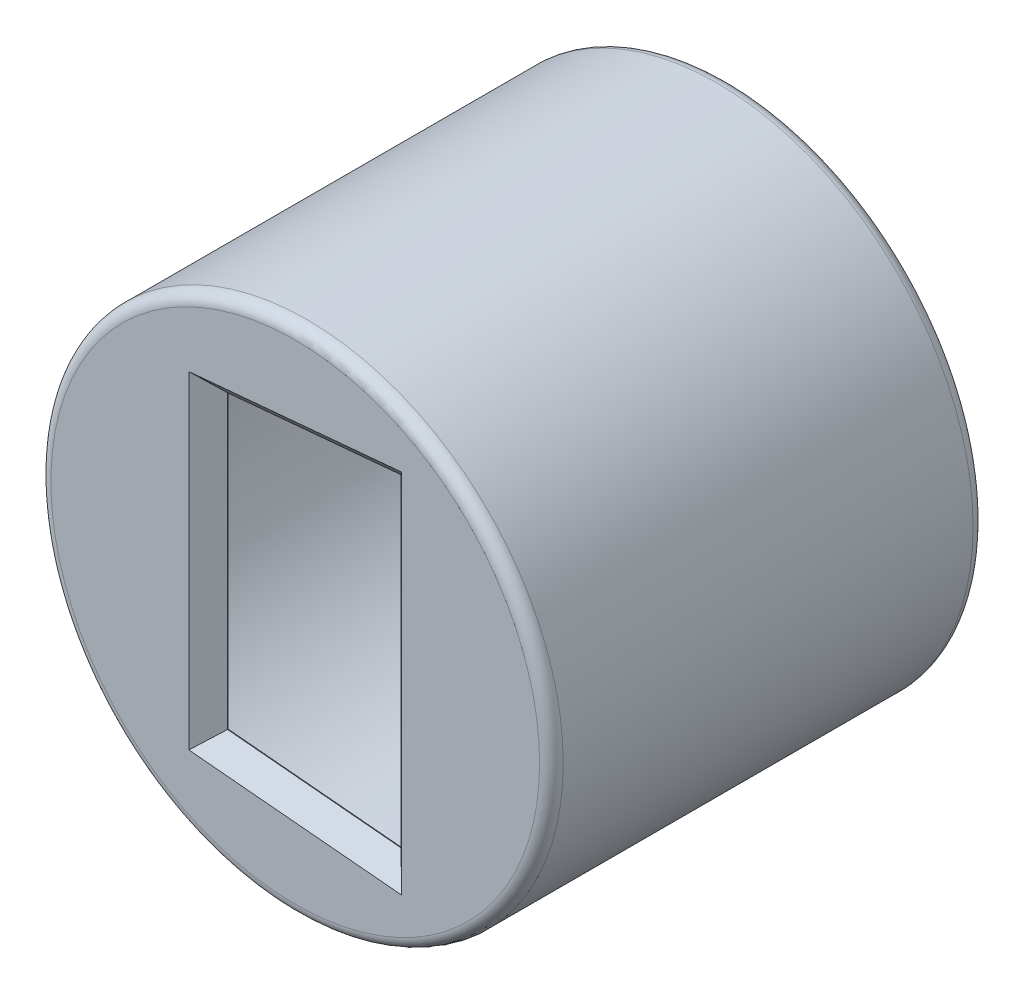
ISO-10303-21;
HEADER;
FILE_DESCRIPTION(('STEP AP214'),'2;1');
FILE_NAME('part.step','',(''),(''),'','','');
FILE_SCHEMA(('AUTOMOTIVE_DESIGN { 1 0 10303 214 1 1 1 1 }'));
ENDSEC;
DATA;
#1=APPLICATION_CONTEXT('core data for automotive mechanical design processes');
#2=APPLICATION_PROTOCOL_DEFINITION('international standard','automotive_design',2000,#1);
#3=PRODUCT_CONTEXT('',#1,'mechanical');
#4=PRODUCT('Part','Part','',(#3));
#5=PRODUCT_RELATED_PRODUCT_CATEGORY('part','',(#4));
#6=PRODUCT_DEFINITION_FORMATION('','',#4);
#7=PRODUCT_DEFINITION_CONTEXT('part definition',#1,'design');
#8=PRODUCT_DEFINITION('design','',#6,#7);
#9=PRODUCT_DEFINITION_SHAPE('','',#8);
#10=(LENGTH_UNIT() NAMED_UNIT(*) SI_UNIT(.MILLI.,.METRE.));
#11=(NAMED_UNIT(*) PLANE_ANGLE_UNIT() SI_UNIT($,.RADIAN.));
#12=(NAMED_UNIT(*) SI_UNIT($,.STERADIAN.) SOLID_ANGLE_UNIT());
#13=UNCERTAINTY_MEASURE_WITH_UNIT(LENGTH_MEASURE(1.E-05),#10,'distance_accuracy_value','');
#14=(GEOMETRIC_REPRESENTATION_CONTEXT(3) GLOBAL_UNCERTAINTY_ASSIGNED_CONTEXT((#13)) GLOBAL_UNIT_ASSIGNED_CONTEXT((#10,
#11,#12)) REPRESENTATION_CONTEXT('',''));
#15=CARTESIAN_POINT('',(0.,0.,0.));
#16=DIRECTION('',(0.,0.,1.));
#17=DIRECTION('',(1.,0.,0.));
#18=AXIS2_PLACEMENT_3D('',#15,#16,#17);
#19=CARTESIAN_POINT('',(0.,0.,10.));
#20=DIRECTION('',(0.,0.,-1.));
#21=DIRECTION('',(-1.,0.,0.));
#22=AXIS2_PLACEMENT_3D('',#19,#20,#21);
#23=CYLINDRICAL_SURFACE('',#22,6.5);
#24=CARTESIAN_POINT('',(0.,0.,-0.200000000000001));
#25=DIRECTION('',(0.,0.,-1.));
#26=DIRECTION('',(-1.,0.,0.));
#27=AXIS2_PLACEMENT_3D('',#24,#25,#26);
#28=CIRCLE('',#27,6.5);
#29=CARTESIAN_POINT('',(-6.5,0.,-0.200000000000001));
#30=VERTEX_POINT('',#29);
#31=EDGE_CURVE('E53',#30,#30,#28,.F.);
#32=ORIENTED_EDGE('',*,*,#31,.T.);
#33=EDGE_LOOP('',(#32));
#34=FACE_BOUND('',#33,.T.);
#35=CARTESIAN_POINT('',(0.,0.,10.2));
#36=DIRECTION('',(0.,0.,1.));
#37=DIRECTION('',(1.,0.,0.));
#38=AXIS2_PLACEMENT_3D('',#35,#36,#37);
#39=CIRCLE('',#38,6.5);
#40=CARTESIAN_POINT('',(6.5,0.,10.2));
#41=VERTEX_POINT('',#40);
#42=EDGE_CURVE('E266',#41,#41,#39,.F.);
#43=ORIENTED_EDGE('',*,*,#42,.T.);
#44=EDGE_LOOP('',(#43));
#45=FACE_BOUND('',#44,.T.);
#46=ADVANCED_FACE('F45',(#34,#45),#23,.T.);
#47=CARTESIAN_POINT('',(0.,0.,-0.5));
#48=DIRECTION('',(0.,0.,-1.));
#49=DIRECTION('',(-1.,0.,0.));
#50=AXIS2_PLACEMENT_3D('',#47,#48,#49);
#51=PLANE('',#50);
#52=CARTESIAN_POINT('',(0.,0.,-0.5));
#53=DIRECTION('',(0.,0.,-1.));
#54=DIRECTION('',(-1.,0.,0.));
#55=AXIS2_PLACEMENT_3D('',#52,#53,#54);
#56=CIRCLE('',#55,6.2);
#57=CARTESIAN_POINT('',(-6.2,0.,-0.5));
#58=VERTEX_POINT('',#57);
#59=EDGE_CURVE('E263',#58,#58,#56,.T.);
#60=ORIENTED_EDGE('',*,*,#59,.T.);
#61=EDGE_LOOP('',(#60));
#62=FACE_BOUND('',#61,.T.);
#63=DIRECTION('',(0.,1.,0.));
#64=VECTOR('',#63,1.);
#65=CARTESIAN_POINT('',(-1.45,1.8,-0.5));
#66=LINE('',#65,#64);
#67=CARTESIAN_POINT('',(-1.45,-1.7,-0.5));
#68=VERTEX_POINT('',#67);
#69=CARTESIAN_POINT('',(-1.45,1.7,-0.5));
#70=VERTEX_POINT('',#69);
#71=EDGE_CURVE('E285',#68,#70,#66,.T.);
#72=ORIENTED_EDGE('',*,*,#71,.F.);
#73=CARTESIAN_POINT('',(-1.35,-1.7,-0.5));
#74=DIRECTION('',(0.,0.,-1.));
#75=DIRECTION('',(-1.,0.,0.));
#76=AXIS2_PLACEMENT_3D('',#73,#74,#75);
#77=CIRCLE('',#76,0.1);
#78=CARTESIAN_POINT('',(-1.35,-1.8,-0.5));
#79=VERTEX_POINT('',#78);
#80=EDGE_CURVE('E248',#68,#79,#77,.F.);
#81=ORIENTED_EDGE('',*,*,#80,.T.);
#82=DIRECTION('',(-1.,0.,0.));
#83=VECTOR('',#82,1.);
#84=CARTESIAN_POINT('',(1.45,-1.8,-0.5));
#85=LINE('',#84,#83);
#86=CARTESIAN_POINT('',(1.35,-1.8,-0.5));
#87=VERTEX_POINT('',#86);
#88=EDGE_CURVE('E182',#87,#79,#85,.T.);
#89=ORIENTED_EDGE('',*,*,#88,.F.);
#90=CARTESIAN_POINT('',(1.35,-1.7,-0.5));
#91=DIRECTION('',(0.,0.,-1.));
#92=DIRECTION('',(-1.,0.,0.));
#93=AXIS2_PLACEMENT_3D('',#90,#91,#92);
#94=CIRCLE('',#93,0.1);
#95=CARTESIAN_POINT('',(1.45,-1.7,-0.5));
#96=VERTEX_POINT('',#95);
#97=EDGE_CURVE('E252',#87,#96,#94,.F.);
#98=ORIENTED_EDGE('',*,*,#97,.T.);
#99=DIRECTION('',(0.,-1.,0.));
#100=VECTOR('',#99,1.);
#101=CARTESIAN_POINT('',(1.45,1.8,-0.5));
#102=LINE('',#101,#100);
#103=CARTESIAN_POINT('',(1.45,1.7,-0.5));
#104=VERTEX_POINT('',#103);
#105=EDGE_CURVE('E293',#104,#96,#102,.T.);
#106=ORIENTED_EDGE('',*,*,#105,.F.);
#107=CARTESIAN_POINT('',(1.35,1.7,-0.5));
#108=DIRECTION('',(0.,0.,-1.));
#109=DIRECTION('',(-1.,0.,0.));
#110=AXIS2_PLACEMENT_3D('',#107,#108,#109);
#111=CIRCLE('',#110,0.1);
#112=CARTESIAN_POINT('',(1.35,1.8,-0.5));
#113=VERTEX_POINT('',#112);
#114=EDGE_CURVE('E256',#104,#113,#111,.F.);
#115=ORIENTED_EDGE('',*,*,#114,.T.);
#116=DIRECTION('',(1.,0.,0.));
#117=VECTOR('',#116,1.);
#118=CARTESIAN_POINT('',(1.45,1.8,-0.5));
#119=LINE('',#118,#117);
#120=CARTESIAN_POINT('',(-1.35,1.8,-0.5));
#121=VERTEX_POINT('',#120);
#122=EDGE_CURVE('E291',#121,#113,#119,.T.);
#123=ORIENTED_EDGE('',*,*,#122,.F.);
#124=CARTESIAN_POINT('',(-1.35,1.7,-0.5));
#125=DIRECTION('',(0.,0.,-1.));
#126=DIRECTION('',(-1.,0.,0.));
#127=AXIS2_PLACEMENT_3D('',#124,#125,#126);
#128=CIRCLE('',#127,0.1);
#129=EDGE_CURVE('E260',#121,#70,#128,.F.);
#130=ORIENTED_EDGE('',*,*,#129,.T.);
#131=EDGE_LOOP('',(#72,#81,#89,#98,#106,#115,#123,#130));
#132=FACE_BOUND('',#131,.T.);
#133=ADVANCED_FACE('F279',(#62,#132),#51,.T.);
#134=CARTESIAN_POINT('',(0.,0.,10.));
#135=DIRECTION('',(0.,0.,1.));
#136=DIRECTION('',(1.,0.,0.));
#137=AXIS2_PLACEMENT_3D('',#134,#135,#136);
#138=PLANE('',#137);
#139=DIRECTION('',(0.995893206467704,-0.0905357460425182,0.));
#140=VECTOR('',#139,1.);
#141=CARTESIAN_POINT('',(2.2,-4.1,10.));
#142=LINE('',#141,#140);
#143=CARTESIAN_POINT('',(-2.2,-3.7,10.));
#144=VERTEX_POINT('',#143);
#145=CARTESIAN_POINT('',(2.2,-4.1,10.));
#146=VERTEX_POINT('',#145);
#147=EDGE_CURVE('E153',#144,#146,#142,.T.);
#148=ORIENTED_EDGE('',*,*,#147,.T.);
#149=DIRECTION('',(0.,1.,0.));
#150=VECTOR('',#149,1.);
#151=CARTESIAN_POINT('',(2.2,4.1,10.));
#152=LINE('',#151,#150);
#153=CARTESIAN_POINT('',(2.2,4.1,10.));
#154=VERTEX_POINT('',#153);
#155=EDGE_CURVE('E164',#146,#154,#152,.T.);
#156=ORIENTED_EDGE('',*,*,#155,.T.);
#157=DIRECTION('',(-0.995893206467704,-0.0905357460425186,0.));
#158=VECTOR('',#157,1.);
#159=CARTESIAN_POINT('',(-2.2,3.7,10.));
#160=LINE('',#159,#158);
#161=CARTESIAN_POINT('',(-2.2,3.7,10.));
#162=VERTEX_POINT('',#161);
#163=EDGE_CURVE('E170',#154,#162,#160,.T.);
#164=ORIENTED_EDGE('',*,*,#163,.T.);
#165=DIRECTION('',(0.,-1.,0.));
#166=VECTOR('',#165,1.);
#167=CARTESIAN_POINT('',(-2.2,3.7,10.));
#168=LINE('',#167,#166);
#169=EDGE_CURVE('E175',#162,#144,#168,.T.);
#170=ORIENTED_EDGE('',*,*,#169,.T.);
#171=EDGE_LOOP('',(#148,#156,#164,#170));
#172=FACE_BOUND('',#171,.T.);
#173=CARTESIAN_POINT('',(0.,0.,10.));
#174=DIRECTION('',(0.,0.,1.));
#175=DIRECTION('',(1.,0.,0.));
#176=AXIS2_PLACEMENT_3D('',#173,#174,#175);
#177=CIRCLE('',#176,6.);
#178=CARTESIAN_POINT('',(6.,0.,10.));
#179=VERTEX_POINT('',#178);
#180=EDGE_CURVE('E160',#179,#179,#177,.T.);
#181=ORIENTED_EDGE('',*,*,#180,.F.);
#182=EDGE_LOOP('',(#181));
#183=FACE_BOUND('',#182,.T.);
#184=ADVANCED_FACE('F172',(#172,#183),#138,.F.);
#185=CARTESIAN_POINT('',(0.,0.,10.5));
#186=DIRECTION('',(0.,0.,1.));
#187=DIRECTION('',(1.,0.,0.));
#188=AXIS2_PLACEMENT_3D('',#185,#186,#187);
#189=PLANE('',#188);
#190=CARTESIAN_POINT('',(0.,0.,10.5));
#191=DIRECTION('',(0.,0.,1.));
#192=DIRECTION('',(1.,0.,0.));
#193=AXIS2_PLACEMENT_3D('',#190,#191,#192);
#194=CIRCLE('',#193,6.2);
#195=CARTESIAN_POINT('',(6.2,0.,10.5));
#196=VERTEX_POINT('',#195);
#197=EDGE_CURVE('E11',#196,#196,#194,.T.);
#198=ORIENTED_EDGE('',*,*,#197,.T.);
#199=EDGE_LOOP('',(#198));
#200=FACE_BOUND('',#199,.T.);
#201=DIRECTION('',(0.995893206467704,0.0905357460425186,0.));
#202=VECTOR('',#201,1.);
#203=CARTESIAN_POINT('',(-0.396907217283554,4.3659793901191,10.5));
#204=LINE('',#203,#202);
#205=CARTESIAN_POINT('',(-2.7,4.15660731896306,10.5));
#206=VERTEX_POINT('',#205);
#207=CARTESIAN_POINT('',(2.7,4.64751640987215,10.5));
#208=VERTEX_POINT('',#207);
#209=EDGE_CURVE('E201',#206,#208,#204,.T.);
#210=ORIENTED_EDGE('',*,*,#209,.T.);
#211=DIRECTION('',(0.,-1.,0.));
#212=VECTOR('',#211,1.);
#213=CARTESIAN_POINT('',(2.7,0.,10.5));
#214=LINE('',#213,#212);
#215=CARTESIAN_POINT('',(2.7,-4.64751640987215,10.5));
#216=VERTEX_POINT('',#215);
#217=EDGE_CURVE('E205',#208,#216,#214,.T.);
#218=ORIENTED_EDGE('',*,*,#217,.T.);
#219=DIRECTION('',(-0.995893206467704,0.0905357460425182,0.));
#220=VECTOR('',#219,1.);
#221=CARTESIAN_POINT('',(-0.396907217283553,-4.3659793901191,10.5));
#222=LINE('',#221,#220);
#223=CARTESIAN_POINT('',(-2.7,-4.15660731896306,10.5));
#224=VERTEX_POINT('',#223);
#225=EDGE_CURVE('E203',#216,#224,#222,.T.);
#226=ORIENTED_EDGE('',*,*,#225,.T.);
#227=DIRECTION('',(0.,1.,0.));
#228=VECTOR('',#227,1.);
#229=CARTESIAN_POINT('',(-2.7,0.,10.5));
#230=LINE('',#229,#228);
#231=EDGE_CURVE('E199',#224,#206,#230,.T.);
#232=ORIENTED_EDGE('',*,*,#231,.T.);
#233=EDGE_LOOP('',(#210,#218,#226,#232));
#234=FACE_BOUND('',#233,.T.);
#235=ADVANCED_FACE('F382',(#200,#234),#189,.T.);
#236=CARTESIAN_POINT('',(2.2,-4.1,10.5));
#237=DIRECTION('',(0.0905357460425182,0.995893206467704,0.));
#238=DIRECTION('',(-0.995893206467704,0.0905357460425182,0.));
#239=AXIS2_PLACEMENT_3D('',#236,#237,#238);
#240=PLANE('',#239);
#241=DIRECTION('',(0.,0.,-1.));
#242=VECTOR('',#241,1.);
#243=CARTESIAN_POINT('',(-2.2,-3.7,10.5));
#244=LINE('',#243,#242);
#245=CARTESIAN_POINT('',(-2.2,-3.7,10.0171556125965));
#246=VERTEX_POINT('',#245);
#247=EDGE_CURVE('E187',#246,#144,#244,.T.);
#248=ORIENTED_EDGE('',*,*,#247,.F.);
#249=DIRECTION('',(0.995893206467704,-0.0905357460425182,0.));
#250=VECTOR('',#249,1.);
#251=CARTESIAN_POINT('',(2.2,-4.1,10.0171556125965));
#252=LINE('',#251,#250);
#253=CARTESIAN_POINT('',(2.2,-4.1,10.0171556125965));
#254=VERTEX_POINT('',#253);
#255=EDGE_CURVE('E156',#246,#254,#252,.T.);
#256=ORIENTED_EDGE('',*,*,#255,.T.);
#257=DIRECTION('',(0.,0.,-1.));
#258=VECTOR('',#257,1.);
#259=CARTESIAN_POINT('',(2.2,-4.1,10.5));
#260=LINE('',#259,#258);
#261=EDGE_CURVE('E148',#254,#146,#260,.T.);
#262=ORIENTED_EDGE('',*,*,#261,.T.);
#263=ORIENTED_EDGE('',*,*,#147,.F.);
#264=EDGE_LOOP('',(#248,#256,#262,#263));
#265=FACE_BOUND('',#264,.T.);
#266=ADVANCED_FACE('F151',(#265),#240,.T.);
#267=CARTESIAN_POINT('',(2.2,4.1,10.5));
#268=DIRECTION('',(-1.,0.,0.));
#269=DIRECTION('',(0.,-1.,0.));
#270=AXIS2_PLACEMENT_3D('',#267,#268,#269);
#271=PLANE('',#270);
#272=ORIENTED_EDGE('',*,*,#261,.F.);
#273=DIRECTION('',(0.,1.,0.));
#274=VECTOR('',#273,1.);
#275=CARTESIAN_POINT('',(2.2,4.1,10.0171556125965));
#276=LINE('',#275,#274);
#277=CARTESIAN_POINT('',(2.2,4.1,10.0171556125965));
#278=VERTEX_POINT('',#277);
#279=EDGE_CURVE('E197',#254,#278,#276,.T.);
#280=ORIENTED_EDGE('',*,*,#279,.T.);
#281=DIRECTION('',(0.,0.,-1.));
#282=VECTOR('',#281,1.);
#283=CARTESIAN_POINT('',(2.2,4.1,10.5));
#284=LINE('',#283,#282);
#285=EDGE_CURVE('E161',#278,#154,#284,.T.);
#286=ORIENTED_EDGE('',*,*,#285,.T.);
#287=ORIENTED_EDGE('',*,*,#155,.F.);
#288=EDGE_LOOP('',(#272,#280,#286,#287));
#289=FACE_BOUND('',#288,.T.);
#290=ADVANCED_FACE('F165',(#289),#271,.T.);
#291=CARTESIAN_POINT('',(-2.2,3.7,10.5));
#292=DIRECTION('',(0.0905357460425186,-0.995893206467704,0.));
#293=DIRECTION('',(0.995893206467704,0.0905357460425186,0.));
#294=AXIS2_PLACEMENT_3D('',#291,#292,#293);
#295=PLANE('',#294);
#296=ORIENTED_EDGE('',*,*,#285,.F.);
#297=DIRECTION('',(-0.995893206467704,-0.0905357460425186,0.));
#298=VECTOR('',#297,1.);
#299=CARTESIAN_POINT('',(-2.2,3.7,10.0171556125965));
#300=LINE('',#299,#298);
#301=CARTESIAN_POINT('',(-2.2,3.7,10.0171556125965));
#302=VERTEX_POINT('',#301);
#303=EDGE_CURVE('E209',#278,#302,#300,.T.);
#304=ORIENTED_EDGE('',*,*,#303,.T.);
#305=DIRECTION('',(0.,0.,-1.));
#306=VECTOR('',#305,1.);
#307=CARTESIAN_POINT('',(-2.2,3.7,10.5));
#308=LINE('',#307,#306);
#309=EDGE_CURVE('E189',#302,#162,#308,.T.);
#310=ORIENTED_EDGE('',*,*,#309,.T.);
#311=ORIENTED_EDGE('',*,*,#163,.F.);
#312=EDGE_LOOP('',(#296,#304,#310,#311));
#313=FACE_BOUND('',#312,.T.);
#314=ADVANCED_FACE('F386',(#313),#295,.T.);
#315=CARTESIAN_POINT('',(-2.2,3.7,10.5));
#316=DIRECTION('',(1.,0.,0.));
#317=DIRECTION('',(0.,1.,0.));
#318=AXIS2_PLACEMENT_3D('',#315,#316,#317);
#319=PLANE('',#318);
#320=ORIENTED_EDGE('',*,*,#309,.F.);
#321=DIRECTION('',(0.,-1.,0.));
#322=VECTOR('',#321,1.);
#323=CARTESIAN_POINT('',(-2.2,3.7,10.0171556125965));
#324=LINE('',#323,#322);
#325=EDGE_CURVE('E211',#302,#246,#324,.T.);
#326=ORIENTED_EDGE('',*,*,#325,.T.);
#327=ORIENTED_EDGE('',*,*,#247,.T.);
#328=ORIENTED_EDGE('',*,*,#169,.F.);
#329=EDGE_LOOP('',(#320,#326,#327,#328));
#330=FACE_BOUND('',#329,.T.);
#331=ADVANCED_FACE('F389',(#330),#319,.T.);
#332=CARTESIAN_POINT('',(0.,0.,0.));
#333=DIRECTION('',(0.,0.,-1.));
#334=DIRECTION('',(-1.,0.,0.));
#335=AXIS2_PLACEMENT_3D('',#332,#333,#334);
#336=PLANE('',#335);
#337=DIRECTION('',(0.,-1.,0.));
#338=VECTOR('',#337,1.);
#339=CARTESIAN_POINT('',(1.45,0.,0.));
#340=LINE('',#339,#338);
#341=CARTESIAN_POINT('',(1.45,1.7,0.));
#342=VERTEX_POINT('',#341);
#343=CARTESIAN_POINT('',(1.45,-1.7,0.));
#344=VERTEX_POINT('',#343);
#345=EDGE_CURVE('E221',#342,#344,#340,.T.);
#346=ORIENTED_EDGE('',*,*,#345,.T.);
#347=CARTESIAN_POINT('',(1.35,-1.7,0.));
#348=DIRECTION('',(0.,0.,-1.));
#349=DIRECTION('',(-1.,0.,0.));
#350=AXIS2_PLACEMENT_3D('',#347,#348,#349);
#351=CIRCLE('',#350,0.1);
#352=CARTESIAN_POINT('',(1.35,-1.8,0.));
#353=VERTEX_POINT('',#352);
#354=EDGE_CURVE('E254',#344,#353,#351,.T.);
#355=ORIENTED_EDGE('',*,*,#354,.T.);
#356=DIRECTION('',(-1.,0.,0.));
#357=VECTOR('',#356,1.);
#358=CARTESIAN_POINT('',(0.,-1.8,0.));
#359=LINE('',#358,#357);
#360=CARTESIAN_POINT('',(-1.35,-1.8,0.));
#361=VERTEX_POINT('',#360);
#362=EDGE_CURVE('E224',#353,#361,#359,.T.);
#363=ORIENTED_EDGE('',*,*,#362,.T.);
#364=CARTESIAN_POINT('',(-1.35,-1.7,0.));
#365=DIRECTION('',(0.,0.,-1.));
#366=DIRECTION('',(-1.,0.,0.));
#367=AXIS2_PLACEMENT_3D('',#364,#365,#366);
#368=CIRCLE('',#367,0.1);
#369=CARTESIAN_POINT('',(-1.45,-1.7,0.));
#370=VERTEX_POINT('',#369);
#371=EDGE_CURVE('E250',#361,#370,#368,.T.);
#372=ORIENTED_EDGE('',*,*,#371,.T.);
#373=DIRECTION('',(0.,1.,0.));
#374=VECTOR('',#373,1.);
#375=CARTESIAN_POINT('',(-1.45,0.,0.));
#376=LINE('',#375,#374);
#377=CARTESIAN_POINT('',(-1.45,1.7,0.));
#378=VERTEX_POINT('',#377);
#379=EDGE_CURVE('E227',#370,#378,#376,.T.);
#380=ORIENTED_EDGE('',*,*,#379,.T.);
#381=CARTESIAN_POINT('',(-1.35,1.7,0.));
#382=DIRECTION('',(0.,0.,-1.));
#383=DIRECTION('',(-1.,0.,0.));
#384=AXIS2_PLACEMENT_3D('',#381,#382,#383);
#385=CIRCLE('',#384,0.1);
#386=CARTESIAN_POINT('',(-1.35,1.8,0.));
#387=VERTEX_POINT('',#386);
#388=EDGE_CURVE('E67',#378,#387,#385,.T.);
#389=ORIENTED_EDGE('',*,*,#388,.T.);
#390=DIRECTION('',(1.,0.,0.));
#391=VECTOR('',#390,1.);
#392=CARTESIAN_POINT('',(0.,1.8,0.));
#393=LINE('',#392,#391);
#394=CARTESIAN_POINT('',(1.35,1.8,0.));
#395=VERTEX_POINT('',#394);
#396=EDGE_CURVE('E213',#387,#395,#393,.T.);
#397=ORIENTED_EDGE('',*,*,#396,.T.);
#398=CARTESIAN_POINT('',(1.35,1.7,0.));
#399=DIRECTION('',(0.,0.,-1.));
#400=DIRECTION('',(-1.,0.,0.));
#401=AXIS2_PLACEMENT_3D('',#398,#399,#400);
#402=CIRCLE('',#401,0.1);
#403=EDGE_CURVE('E258',#395,#342,#402,.T.);
#404=ORIENTED_EDGE('',*,*,#403,.T.);
#405=EDGE_LOOP('',(#346,#355,#363,#372,#380,#389,#397,#404));
#406=FACE_BOUND('',#405,.T.);
#407=CARTESIAN_POINT('',(0.,0.,0.));
#408=DIRECTION('',(0.,0.,1.));
#409=DIRECTION('',(1.,0.,0.));
#410=AXIS2_PLACEMENT_3D('',#407,#408,#409);
#411=CIRCLE('',#410,6.);
#412=CARTESIAN_POINT('',(6.,0.,0.));
#413=VERTEX_POINT('',#412);
#414=EDGE_CURVE('E194',#413,#413,#411,.T.);
#415=ORIENTED_EDGE('',*,*,#414,.T.);
#416=EDGE_LOOP('',(#415));
#417=FACE_BOUND('',#416,.T.);
#418=ADVANCED_FACE('F309',(#406,#417),#336,.F.);
#419=CARTESIAN_POINT('',(0.,0.,10.));
#420=DIRECTION('',(0.,0.,-1.));
#421=DIRECTION('',(-1.,0.,0.));
#422=AXIS2_PLACEMENT_3D('',#419,#420,#421);
#423=CYLINDRICAL_SURFACE('',#422,6.);
#424=ORIENTED_EDGE('',*,*,#180,.T.);
#425=EDGE_LOOP('',(#424));
#426=FACE_BOUND('',#425,.T.);
#427=ORIENTED_EDGE('',*,*,#414,.F.);
#428=EDGE_LOOP('',(#427));
#429=FACE_BOUND('',#428,.T.);
#430=ADVANCED_FACE('F339',(#426,#429),#423,.F.);
#431=CARTESIAN_POINT('',(-2.2,3.7,10.0171556125965));
#432=DIRECTION('',(-0.694658370458996,0.,-0.719339800338652));
#433=DIRECTION('',(0.,-1.,0.));
#434=AXIS2_PLACEMENT_3D('',#431,#432,#433);
#435=PLANE('',#434);
#436=DIRECTION('',(-0.601220006226584,0.549042910300146,0.58059141120245));
#437=VECTOR('',#436,1.);
#438=CARTESIAN_POINT('',(-2.2,3.7,10.0171556125965));
#439=LINE('',#438,#437);
#440=EDGE_CURVE('E179',#206,#302,#439,.F.);
#441=ORIENTED_EDGE('',*,*,#440,.F.);
#442=ORIENTED_EDGE('',*,*,#231,.F.);
#443=DIRECTION('',(0.601220006226584,0.549042910300147,-0.580591411202449));
#444=VECTOR('',#443,1.);
#445=CARTESIAN_POINT('',(-0.741590050876515,-2.36815868636335,8.60878549566096));
#446=LINE('',#445,#444);
#447=EDGE_CURVE('E176',#246,#224,#446,.F.);
#448=ORIENTED_EDGE('',*,*,#447,.F.);
#449=ORIENTED_EDGE('',*,*,#325,.F.);
#450=EDGE_LOOP('',(#441,#442,#448,#449));
#451=FACE_BOUND('',#450,.T.);
#452=ADVANCED_FACE('F362',(#451),#435,.F.);
#453=CARTESIAN_POINT('',(2.2,-4.1,10.0171556125965));
#454=DIRECTION('',(-0.0628914138141852,-0.691805551956039,-0.719339800338653));
#455=DIRECTION('',(0.995893206467704,-0.0905357460425182,0.));
#456=AXIS2_PLACEMENT_3D('',#453,#454,#455);
#457=PLANE('',#456);
#458=ORIENTED_EDGE('',*,*,#447,.T.);
#459=ORIENTED_EDGE('',*,*,#225,.F.);
#460=DIRECTION('',(-0.565084342449122,0.618785900905414,-0.545695606322352));
#461=VECTOR('',#460,1.);
#462=CARTESIAN_POINT('',(-0.667263036225369,-0.960252872493537,7.24827188409439));
#463=LINE('',#462,#461);
#464=EDGE_CURVE('E216',#254,#216,#463,.F.);
#465=ORIENTED_EDGE('',*,*,#464,.F.);
#466=ORIENTED_EDGE('',*,*,#255,.F.);
#467=EDGE_LOOP('',(#458,#459,#465,#466));
#468=FACE_BOUND('',#467,.T.);
#469=ADVANCED_FACE('F355',(#468),#457,.F.);
#470=CARTESIAN_POINT('',(-2.2,3.7,10.0171556125965));
#471=DIRECTION('',(-0.0628914138141855,0.69180555195604,-0.719339800338652));
#472=DIRECTION('',(-0.995893206467704,-0.0905357460425186,0.));
#473=AXIS2_PLACEMENT_3D('',#470,#471,#472);
#474=PLANE('',#473);
#475=ORIENTED_EDGE('',*,*,#440,.T.);
#476=ORIENTED_EDGE('',*,*,#303,.F.);
#477=DIRECTION('',(0.565084342449122,0.618785900905414,0.545695606322352));
#478=VECTOR('',#477,1.);
#479=CARTESIAN_POINT('',(2.2,4.1,10.0171556125965));
#480=LINE('',#479,#478);
#481=EDGE_CURVE('E214',#208,#278,#480,.F.);
#482=ORIENTED_EDGE('',*,*,#481,.F.);
#483=ORIENTED_EDGE('',*,*,#209,.F.);
#484=EDGE_LOOP('',(#475,#476,#482,#483));
#485=FACE_BOUND('',#484,.T.);
#486=ADVANCED_FACE('F348',(#485),#474,.F.);
#487=CARTESIAN_POINT('',(2.2,4.1,10.0171556125965));
#488=DIRECTION('',(0.694658370458996,0.,-0.719339800338652));
#489=DIRECTION('',(0.,1.,0.));
#490=AXIS2_PLACEMENT_3D('',#487,#488,#489);
#491=PLANE('',#490);
#492=ORIENTED_EDGE('',*,*,#464,.T.);
#493=ORIENTED_EDGE('',*,*,#217,.F.);
#494=ORIENTED_EDGE('',*,*,#481,.T.);
#495=ORIENTED_EDGE('',*,*,#279,.F.);
#496=EDGE_LOOP('',(#492,#493,#494,#495));
#497=FACE_BOUND('',#496,.T.);
#498=ADVANCED_FACE('F342',(#497),#491,.F.);
#499=CARTESIAN_POINT('',(-1.45,1.8,0.5));
#500=DIRECTION('',(-1.,0.,0.));
#501=DIRECTION('',(0.,-1.,0.));
#502=AXIS2_PLACEMENT_3D('',#499,#500,#501);
#503=PLANE('',#502);
#504=ORIENTED_EDGE('',*,*,#379,.F.);
#505=DIRECTION('',(0.,0.,-1.));
#506=VECTOR('',#505,1.);
#507=CARTESIAN_POINT('',(-1.45,-1.7,-0.5));
#508=LINE('',#507,#506);
#509=EDGE_CURVE('E231',#370,#68,#508,.T.);
#510=ORIENTED_EDGE('',*,*,#509,.T.);
#511=ORIENTED_EDGE('',*,*,#71,.T.);
#512=DIRECTION('',(0.,0.,-1.));
#513=VECTOR('',#512,1.);
#514=CARTESIAN_POINT('',(-1.45,1.7,0.));
#515=LINE('',#514,#513);
#516=EDGE_CURVE('E229',#70,#378,#515,.F.);
#517=ORIENTED_EDGE('',*,*,#516,.T.);
#518=EDGE_LOOP('',(#504,#510,#511,#517));
#519=FACE_BOUND('',#518,.T.);
#520=ADVANCED_FACE('F311',(#519),#503,.F.);
#521=CARTESIAN_POINT('',(1.45,-1.8,0.5));
#522=DIRECTION('',(0.,-1.,0.));
#523=DIRECTION('',(0.,0.,-1.));
#524=AXIS2_PLACEMENT_3D('',#521,#522,#523);
#525=PLANE('',#524);
#526=ORIENTED_EDGE('',*,*,#88,.T.);
#527=DIRECTION('',(0.,0.,-1.));
#528=VECTOR('',#527,1.);
#529=CARTESIAN_POINT('',(-1.35,-1.8,0.));
#530=LINE('',#529,#528);
#531=EDGE_CURVE('E237',#79,#361,#530,.F.);
#532=ORIENTED_EDGE('',*,*,#531,.T.);
#533=ORIENTED_EDGE('',*,*,#362,.F.);
#534=DIRECTION('',(0.,0.,-1.));
#535=VECTOR('',#534,1.);
#536=CARTESIAN_POINT('',(1.35,-1.8,-0.5));
#537=LINE('',#536,#535);
#538=EDGE_CURVE('E234',#353,#87,#537,.T.);
#539=ORIENTED_EDGE('',*,*,#538,.T.);
#540=EDGE_LOOP('',(#526,#532,#533,#539));
#541=FACE_BOUND('',#540,.T.);
#542=ADVANCED_FACE('F301',(#541),#525,.F.);
#543=CARTESIAN_POINT('',(1.45,1.8,0.5));
#544=DIRECTION('',(1.,0.,0.));
#545=DIRECTION('',(0.,1.,0.));
#546=AXIS2_PLACEMENT_3D('',#543,#544,#545);
#547=PLANE('',#546);
#548=ORIENTED_EDGE('',*,*,#105,.T.);
#549=DIRECTION('',(0.,0.,-1.));
#550=VECTOR('',#549,1.);
#551=CARTESIAN_POINT('',(1.45,-1.7,0.));
#552=LINE('',#551,#550);
#553=EDGE_CURVE('E242',#96,#344,#552,.F.);
#554=ORIENTED_EDGE('',*,*,#553,.T.);
#555=ORIENTED_EDGE('',*,*,#345,.F.);
#556=DIRECTION('',(0.,0.,-1.));
#557=VECTOR('',#556,1.);
#558=CARTESIAN_POINT('',(1.45,1.7,-0.5));
#559=LINE('',#558,#557);
#560=EDGE_CURVE('E239',#342,#104,#559,.T.);
#561=ORIENTED_EDGE('',*,*,#560,.T.);
#562=EDGE_LOOP('',(#548,#554,#555,#561));
#563=FACE_BOUND('',#562,.T.);
#564=ADVANCED_FACE('F320',(#563),#547,.F.);
#565=CARTESIAN_POINT('',(1.45,1.8,0.5));
#566=DIRECTION('',(0.,1.,0.));
#567=DIRECTION('',(0.,0.,1.));
#568=AXIS2_PLACEMENT_3D('',#565,#566,#567);
#569=PLANE('',#568);
#570=ORIENTED_EDGE('',*,*,#122,.T.);
#571=DIRECTION('',(0.,0.,-1.));
#572=VECTOR('',#571,1.);
#573=CARTESIAN_POINT('',(1.35,1.8,0.));
#574=LINE('',#573,#572);
#575=EDGE_CURVE('E60',#113,#395,#574,.F.);
#576=ORIENTED_EDGE('',*,*,#575,.T.);
#577=ORIENTED_EDGE('',*,*,#396,.F.);
#578=DIRECTION('',(0.,0.,-1.));
#579=VECTOR('',#578,1.);
#580=CARTESIAN_POINT('',(-1.35,1.8,-0.5));
#581=LINE('',#580,#579);
#582=EDGE_CURVE('E244',#387,#121,#581,.T.);
#583=ORIENTED_EDGE('',*,*,#582,.T.);
#584=EDGE_LOOP('',(#570,#576,#577,#583));
#585=FACE_BOUND('',#584,.T.);
#586=ADVANCED_FACE('F314',(#585),#569,.F.);
#587=CARTESIAN_POINT('',(-1.35,-1.7,0.5));
#588=DIRECTION('',(0.,0.,1.));
#589=DIRECTION('',(1.,0.,0.));
#590=AXIS2_PLACEMENT_3D('',#587,#588,#589);
#591=CYLINDRICAL_SURFACE('',#590,0.1);
#592=ORIENTED_EDGE('',*,*,#371,.F.);
#593=ORIENTED_EDGE('',*,*,#531,.F.);
#594=ORIENTED_EDGE('',*,*,#80,.F.);
#595=ORIENTED_EDGE('',*,*,#509,.F.);
#596=EDGE_LOOP('',(#592,#593,#594,#595));
#597=FACE_BOUND('',#596,.T.);
#598=ADVANCED_FACE('F306',(#597),#591,.F.);
#599=CARTESIAN_POINT('',(1.35,-1.7,0.5));
#600=DIRECTION('',(0.,0.,1.));
#601=DIRECTION('',(1.,0.,0.));
#602=AXIS2_PLACEMENT_3D('',#599,#600,#601);
#603=CYLINDRICAL_SURFACE('',#602,0.1);
#604=ORIENTED_EDGE('',*,*,#354,.F.);
#605=ORIENTED_EDGE('',*,*,#553,.F.);
#606=ORIENTED_EDGE('',*,*,#97,.F.);
#607=ORIENTED_EDGE('',*,*,#538,.F.);
#608=EDGE_LOOP('',(#604,#605,#606,#607));
#609=FACE_BOUND('',#608,.T.);
#610=ADVANCED_FACE('F323',(#609),#603,.F.);
#611=CARTESIAN_POINT('',(1.35,1.7,0.5));
#612=DIRECTION('',(0.,0.,1.));
#613=DIRECTION('',(1.,0.,0.));
#614=AXIS2_PLACEMENT_3D('',#611,#612,#613);
#615=CYLINDRICAL_SURFACE('',#614,0.1);
#616=ORIENTED_EDGE('',*,*,#403,.F.);
#617=ORIENTED_EDGE('',*,*,#575,.F.);
#618=ORIENTED_EDGE('',*,*,#114,.F.);
#619=ORIENTED_EDGE('',*,*,#560,.F.);
#620=EDGE_LOOP('',(#616,#617,#618,#619));
#621=FACE_BOUND('',#620,.T.);
#622=ADVANCED_FACE('F318',(#621),#615,.F.);
#623=CARTESIAN_POINT('',(-1.35,1.7,0.5));
#624=DIRECTION('',(0.,0.,1.));
#625=DIRECTION('',(1.,0.,0.));
#626=AXIS2_PLACEMENT_3D('',#623,#624,#625);
#627=CYLINDRICAL_SURFACE('',#626,0.1);
#628=ORIENTED_EDGE('',*,*,#388,.F.);
#629=ORIENTED_EDGE('',*,*,#516,.F.);
#630=ORIENTED_EDGE('',*,*,#129,.F.);
#631=ORIENTED_EDGE('',*,*,#582,.F.);
#632=EDGE_LOOP('',(#628,#629,#630,#631));
#633=FACE_BOUND('',#632,.T.);
#634=ADVANCED_FACE('F276',(#633),#627,.F.);
#635=CARTESIAN_POINT('',(0.,0.,-0.200000000000001));
#636=DIRECTION('',(0.,0.,-1.));
#637=DIRECTION('',(-1.,0.,0.));
#638=AXIS2_PLACEMENT_3D('',#635,#636,#637);
#639=TOROIDAL_SURFACE('',#638,6.2,0.3);
#640=ORIENTED_EDGE('',*,*,#31,.F.);
#641=EDGE_LOOP('',(#640));
#642=FACE_BOUND('',#641,.T.);
#643=ORIENTED_EDGE('',*,*,#59,.F.);
#644=EDGE_LOOP('',(#643));
#645=FACE_BOUND('',#644,.T.);
#646=ADVANCED_FACE('F273',(#642,#645),#639,.T.);
#647=CARTESIAN_POINT('',(0.,0.,10.2));
#648=DIRECTION('',(0.,0.,1.));
#649=DIRECTION('',(1.,0.,0.));
#650=AXIS2_PLACEMENT_3D('',#647,#648,#649);
#651=TOROIDAL_SURFACE('',#650,6.2,0.3);
#652=ORIENTED_EDGE('',*,*,#42,.F.);
#653=EDGE_LOOP('',(#652));
#654=FACE_BOUND('',#653,.T.);
#655=ORIENTED_EDGE('',*,*,#197,.F.);
#656=EDGE_LOOP('',(#655));
#657=FACE_BOUND('',#656,.T.);
#658=ADVANCED_FACE('F47',(#654,#657),#651,.T.);
#659=CLOSED_SHELL('',(#46,#133,#184,#235,#266,#290,#314,#331,#418,#430,#452,#469,#486,#498,#520,
#542,#564,#586,#598,#610,#622,#634,#646,#658));
#660=MANIFOLD_SOLID_BREP('B2',#659);
#661=ADVANCED_BREP_SHAPE_REPRESENTATION('',(#18,#660),#14);
#662=SHAPE_DEFINITION_REPRESENTATION(#9,#661);
ENDSEC;
END-ISO-10303-21;
